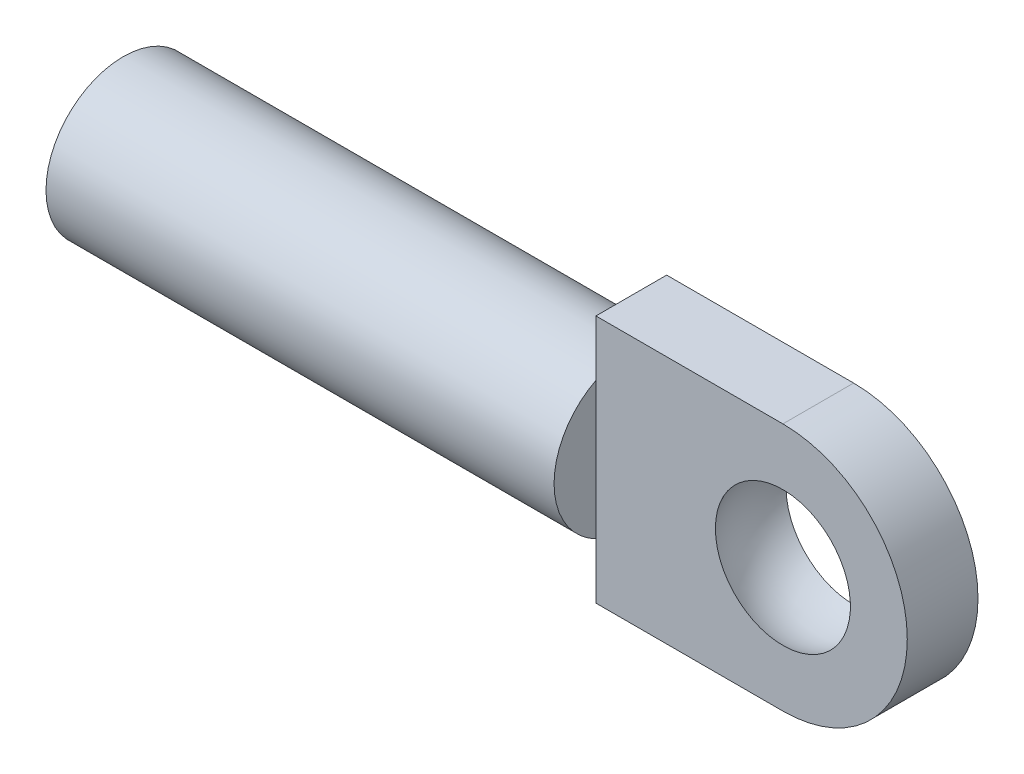
ISO-10303-21;
HEADER;
FILE_DESCRIPTION(('STEP AP214'),'2;1');
FILE_NAME('part.step','',(''),(''),'','','');
FILE_SCHEMA(('AUTOMOTIVE_DESIGN { 1 0 10303 214 1 1 1 1 }'));
ENDSEC;
DATA;
#1=APPLICATION_CONTEXT('core data for automotive mechanical design processes');
#2=APPLICATION_PROTOCOL_DEFINITION('international standard','automotive_design',2000,#1);
#3=PRODUCT_CONTEXT('',#1,'mechanical');
#4=PRODUCT('Part','Part','',(#3));
#5=PRODUCT_RELATED_PRODUCT_CATEGORY('part','',(#4));
#6=PRODUCT_DEFINITION_FORMATION('','',#4);
#7=PRODUCT_DEFINITION_CONTEXT('part definition',#1,'design');
#8=PRODUCT_DEFINITION('design','',#6,#7);
#9=PRODUCT_DEFINITION_SHAPE('','',#8);
#10=(LENGTH_UNIT() NAMED_UNIT(*) SI_UNIT(.MILLI.,.METRE.));
#11=(NAMED_UNIT(*) PLANE_ANGLE_UNIT() SI_UNIT($,.RADIAN.));
#12=(NAMED_UNIT(*) SI_UNIT($,.STERADIAN.) SOLID_ANGLE_UNIT());
#13=UNCERTAINTY_MEASURE_WITH_UNIT(LENGTH_MEASURE(1.E-05),#10,'distance_accuracy_value','');
#14=(GEOMETRIC_REPRESENTATION_CONTEXT(3) GLOBAL_UNCERTAINTY_ASSIGNED_CONTEXT((#13)) GLOBAL_UNIT_ASSIGNED_CONTEXT((#10,
#11,#12)) REPRESENTATION_CONTEXT('',''));
#15=CARTESIAN_POINT('',(0.,0.,0.));
#16=DIRECTION('',(0.,0.,1.));
#17=DIRECTION('',(1.,0.,0.));
#18=AXIS2_PLACEMENT_3D('',#15,#16,#17);
#19=CARTESIAN_POINT('',(0.,0.,-1.1049));
#20=DIRECTION('',(0.,0.,-1.));
#21=DIRECTION('',(-1.,0.,0.));
#22=AXIS2_PLACEMENT_3D('',#19,#20,#21);
#23=PLANE('',#22);
#24=CARTESIAN_POINT('',(0.,0.,-1.1049));
#25=DIRECTION('',(0.,0.,1.));
#26=DIRECTION('',(-1.,0.,0.));
#27=AXIS2_PLACEMENT_3D('',#24,#25,#26);
#28=CIRCLE('',#27,3.8862);
#29=CARTESIAN_POINT('',(0.,-3.8862,-1.1049));
#30=VERTEX_POINT('',#29);
#31=CARTESIAN_POINT('',(0.,3.8862,-1.1049));
#32=VERTEX_POINT('',#31);
#33=EDGE_CURVE('E125',#30,#32,#28,.T.);
#34=ORIENTED_EDGE('',*,*,#33,.F.);
#35=DIRECTION('',(1.,0.,0.));
#36=VECTOR('',#35,1.);
#37=CARTESIAN_POINT('',(0.,-3.8862,-1.1049));
#38=LINE('',#37,#36);
#39=CARTESIAN_POINT('',(-5.842,-3.8862,-1.1049));
#40=VERTEX_POINT('',#39);
#41=EDGE_CURVE('E134',#40,#30,#38,.T.);
#42=ORIENTED_EDGE('',*,*,#41,.F.);
#43=DIRECTION('',(0.,-1.,0.));
#44=VECTOR('',#43,1.);
#45=CARTESIAN_POINT('',(-5.842,3.8862,-1.1049));
#46=LINE('',#45,#44);
#47=CARTESIAN_POINT('',(-5.842,-2.14517248490652,-1.1049));
#48=VERTEX_POINT('',#47);
#49=EDGE_CURVE('E131',#48,#40,#46,.T.);
#50=ORIENTED_EDGE('',*,*,#49,.F.);
#51=CARTESIAN_POINT('',(-5.842,2.14517248490652,-1.1049));
#52=VERTEX_POINT('',#51);
#53=EDGE_CURVE('E55',#52,#48,#46,.T.);
#54=ORIENTED_EDGE('',*,*,#53,.F.);
#55=CARTESIAN_POINT('',(-5.842,3.8862,-1.1049));
#56=VERTEX_POINT('',#55);
#57=EDGE_CURVE('E132',#56,#52,#46,.T.);
#58=ORIENTED_EDGE('',*,*,#57,.F.);
#59=DIRECTION('',(-1.,0.,0.));
#60=VECTOR('',#59,1.);
#61=CARTESIAN_POINT('',(0.,3.8862,-1.1049));
#62=LINE('',#61,#60);
#63=EDGE_CURVE('E128',#32,#56,#62,.T.);
#64=ORIENTED_EDGE('',*,*,#63,.F.);
#65=EDGE_LOOP('',(#34,#42,#50,#54,#58,#64));
#66=FACE_BOUND('',#65,.T.);
#67=CARTESIAN_POINT('',(0.,0.,-1.1049));
#68=DIRECTION('',(0.,0.,-1.));
#69=DIRECTION('',(-1.,0.,0.));
#70=AXIS2_PLACEMENT_3D('',#67,#68,#69);
#71=CIRCLE('',#70,2.10939506790454);
#72=CARTESIAN_POINT('',(-2.10939506790454,0.,-1.1049));
#73=VERTEX_POINT('',#72);
#74=EDGE_CURVE('E275',#73,#73,#71,.F.);
#75=ORIENTED_EDGE('',*,*,#74,.T.);
#76=EDGE_LOOP('',(#75));
#77=FACE_BOUND('',#76,.T.);
#78=ADVANCED_FACE('F31',(#66,#77),#23,.T.);
#79=CARTESIAN_POINT('',(0.,0.,1.1049));
#80=DIRECTION('',(0.,0.,-1.));
#81=DIRECTION('',(-1.,0.,0.));
#82=AXIS2_PLACEMENT_3D('',#79,#80,#81);
#83=PLANE('',#82);
#84=CARTESIAN_POINT('',(0.,0.,1.1049));
#85=DIRECTION('',(0.,0.,1.));
#86=DIRECTION('',(-1.,0.,0.));
#87=AXIS2_PLACEMENT_3D('',#84,#85,#86);
#88=CIRCLE('',#87,3.8862);
#89=CARTESIAN_POINT('',(0.,-3.8862,1.1049));
#90=VERTEX_POINT('',#89);
#91=CARTESIAN_POINT('',(0.,3.8862,1.1049));
#92=VERTEX_POINT('',#91);
#93=EDGE_CURVE('E120',#90,#92,#88,.T.);
#94=ORIENTED_EDGE('',*,*,#93,.T.);
#95=DIRECTION('',(-1.,0.,0.));
#96=VECTOR('',#95,1.);
#97=CARTESIAN_POINT('',(0.,3.8862,1.1049));
#98=LINE('',#97,#96);
#99=CARTESIAN_POINT('',(-5.842,3.8862,1.1049));
#100=VERTEX_POINT('',#99);
#101=EDGE_CURVE('E106',#92,#100,#98,.T.);
#102=ORIENTED_EDGE('',*,*,#101,.T.);
#103=DIRECTION('',(0.,-1.,0.));
#104=VECTOR('',#103,1.);
#105=CARTESIAN_POINT('',(-5.842,3.8862,1.1049));
#106=LINE('',#105,#104);
#107=CARTESIAN_POINT('',(-5.842,2.14517248490652,1.1049));
#108=VERTEX_POINT('',#107);
#109=EDGE_CURVE('E97',#100,#108,#106,.T.);
#110=ORIENTED_EDGE('',*,*,#109,.T.);
#111=CARTESIAN_POINT('',(-5.842,-2.14517248490652,1.1049));
#112=VERTEX_POINT('',#111);
#113=EDGE_CURVE('E88',#108,#112,#106,.T.);
#114=ORIENTED_EDGE('',*,*,#113,.T.);
#115=CARTESIAN_POINT('',(-5.842,-3.8862,1.1049));
#116=VERTEX_POINT('',#115);
#117=EDGE_CURVE('E93',#112,#116,#106,.T.);
#118=ORIENTED_EDGE('',*,*,#117,.T.);
#119=DIRECTION('',(1.,0.,0.));
#120=VECTOR('',#119,1.);
#121=CARTESIAN_POINT('',(0.,-3.8862,1.1049));
#122=LINE('',#121,#120);
#123=EDGE_CURVE('E123',#116,#90,#122,.T.);
#124=ORIENTED_EDGE('',*,*,#123,.T.);
#125=EDGE_LOOP('',(#94,#102,#110,#114,#118,#124));
#126=FACE_BOUND('',#125,.T.);
#127=CARTESIAN_POINT('',(0.,0.,1.1049));
#128=DIRECTION('',(0.,0.,-1.));
#129=DIRECTION('',(-1.,0.,0.));
#130=AXIS2_PLACEMENT_3D('',#127,#128,#129);
#131=CIRCLE('',#130,2.10939506790454);
#132=CARTESIAN_POINT('',(-2.10939506790454,0.,1.1049));
#133=VERTEX_POINT('',#132);
#134=EDGE_CURVE('E35',#133,#133,#131,.F.);
#135=ORIENTED_EDGE('',*,*,#134,.F.);
#136=EDGE_LOOP('',(#135));
#137=FACE_BOUND('',#136,.T.);
#138=ADVANCED_FACE('F90',(#126,#137),#83,.F.);
#139=CARTESIAN_POINT('',(-5.842,3.8862,-1.1049));
#140=DIRECTION('',(-1.,0.,0.));
#141=DIRECTION('',(0.,-1.,0.));
#142=AXIS2_PLACEMENT_3D('',#139,#140,#141);
#143=PLANE('',#142);
#144=CARTESIAN_POINT('',(-5.842,0.,0.));
#145=DIRECTION('',(-1.,0.,0.));
#146=DIRECTION('',(0.,0.,1.));
#147=AXIS2_PLACEMENT_3D('',#144,#145,#146);
#148=CIRCLE('',#147,2.413);
#149=EDGE_CURVE('E42',#108,#52,#148,.T.);
#150=ORIENTED_EDGE('',*,*,#149,.F.);
#151=ORIENTED_EDGE('',*,*,#109,.F.);
#152=DIRECTION('',(0.,0.,1.));
#153=VECTOR('',#152,1.);
#154=CARTESIAN_POINT('',(-5.842,3.8862,-1.1049));
#155=LINE('',#154,#153);
#156=EDGE_CURVE('E140',#56,#100,#155,.T.);
#157=ORIENTED_EDGE('',*,*,#156,.F.);
#158=ORIENTED_EDGE('',*,*,#57,.T.);
#159=EDGE_LOOP('',(#150,#151,#157,#158));
#160=FACE_BOUND('',#159,.T.);
#161=ADVANCED_FACE('F153',(#160),#143,.T.);
#162=CARTESIAN_POINT('',(0.,0.,-1.1049));
#163=DIRECTION('',(0.,0.,1.));
#164=DIRECTION('',(1.,0.,0.));
#165=AXIS2_PLACEMENT_3D('',#162,#163,#164);
#166=CYLINDRICAL_SURFACE('',#165,3.8862);
#167=DIRECTION('',(0.,0.,1.));
#168=VECTOR('',#167,1.);
#169=CARTESIAN_POINT('',(0.,3.8862,-1.1049));
#170=LINE('',#169,#168);
#171=EDGE_CURVE('E137',#32,#92,#170,.T.);
#172=ORIENTED_EDGE('',*,*,#171,.T.);
#173=ORIENTED_EDGE('',*,*,#93,.F.);
#174=DIRECTION('',(0.,0.,1.));
#175=VECTOR('',#174,1.);
#176=CARTESIAN_POINT('',(0.,-3.8862,-1.1049));
#177=LINE('',#176,#175);
#178=EDGE_CURVE('E40',#30,#90,#177,.T.);
#179=ORIENTED_EDGE('',*,*,#178,.F.);
#180=ORIENTED_EDGE('',*,*,#33,.T.);
#181=EDGE_LOOP('',(#172,#173,#179,#180));
#182=FACE_BOUND('',#181,.T.);
#183=ADVANCED_FACE('F33',(#182),#166,.T.);
#184=CARTESIAN_POINT('',(0.,-3.8862,-1.1049));
#185=DIRECTION('',(0.,-1.,0.));
#186=DIRECTION('',(1.,0.,0.));
#187=AXIS2_PLACEMENT_3D('',#184,#185,#186);
#188=PLANE('',#187);
#189=ORIENTED_EDGE('',*,*,#178,.T.);
#190=ORIENTED_EDGE('',*,*,#123,.F.);
#191=DIRECTION('',(0.,0.,1.));
#192=VECTOR('',#191,1.);
#193=CARTESIAN_POINT('',(-5.842,-3.8862,-1.1049));
#194=LINE('',#193,#192);
#195=EDGE_CURVE('E104',#40,#116,#194,.T.);
#196=ORIENTED_EDGE('',*,*,#195,.F.);
#197=ORIENTED_EDGE('',*,*,#41,.T.);
#198=EDGE_LOOP('',(#189,#190,#196,#197));
#199=FACE_BOUND('',#198,.T.);
#200=ADVANCED_FACE('F149',(#199),#188,.T.);
#201=EDGE_CURVE('E11',#48,#112,#148,.T.);
#202=ORIENTED_EDGE('',*,*,#201,.F.);
#203=ORIENTED_EDGE('',*,*,#49,.T.);
#204=ORIENTED_EDGE('',*,*,#195,.T.);
#205=ORIENTED_EDGE('',*,*,#117,.F.);
#206=EDGE_LOOP('',(#202,#203,#204,#205));
#207=FACE_BOUND('',#206,.T.);
#208=ADVANCED_FACE('F102',(#207),#143,.T.);
#209=CARTESIAN_POINT('',(0.,3.8862,-1.1049));
#210=DIRECTION('',(0.,1.,0.));
#211=DIRECTION('',(-1.,0.,0.));
#212=AXIS2_PLACEMENT_3D('',#209,#210,#211);
#213=PLANE('',#212);
#214=ORIENTED_EDGE('',*,*,#156,.T.);
#215=ORIENTED_EDGE('',*,*,#101,.F.);
#216=ORIENTED_EDGE('',*,*,#171,.F.);
#217=ORIENTED_EDGE('',*,*,#63,.T.);
#218=EDGE_LOOP('',(#214,#215,#216,#217));
#219=FACE_BOUND('',#218,.T.);
#220=ADVANCED_FACE('F147',(#219),#213,.T.);
#221=CARTESIAN_POINT('',(-5.842,0.,0.));
#222=DIRECTION('',(-1.,0.,0.));
#223=DIRECTION('',(0.,0.,1.));
#224=AXIS2_PLACEMENT_3D('',#221,#222,#223);
#225=PLANE('',#224);
#226=EDGE_CURVE('E43',#52,#48,#148,.T.);
#227=ORIENTED_EDGE('',*,*,#226,.F.);
#228=ORIENTED_EDGE('',*,*,#53,.T.);
#229=EDGE_LOOP('',(#227,#228));
#230=FACE_BOUND('',#229,.T.);
#231=ADVANCED_FACE('F184',(#230),#225,.F.);
#232=CARTESIAN_POINT('',(-21.717,0.,0.));
#233=DIRECTION('',(1.,0.,0.));
#234=DIRECTION('',(0.,0.,-1.));
#235=AXIS2_PLACEMENT_3D('',#232,#233,#234);
#236=CYLINDRICAL_SURFACE('',#235,2.413);
#237=CARTESIAN_POINT('',(-21.717,0.,0.));
#238=DIRECTION('',(-1.,0.,0.));
#239=DIRECTION('',(0.,0.,1.));
#240=AXIS2_PLACEMENT_3D('',#237,#238,#239);
#241=CIRCLE('',#240,2.413);
#242=CARTESIAN_POINT('',(-21.717,0.,2.413));
#243=VERTEX_POINT('',#242);
#244=EDGE_CURVE('E116',#243,#243,#241,.T.);
#245=ORIENTED_EDGE('',*,*,#244,.F.);
#246=EDGE_LOOP('',(#245));
#247=FACE_BOUND('',#246,.T.);
#248=ORIENTED_EDGE('',*,*,#149,.T.);
#249=ORIENTED_EDGE('',*,*,#226,.T.);
#250=ORIENTED_EDGE('',*,*,#201,.T.);
#251=EDGE_CURVE('E107',#112,#108,#148,.T.);
#252=ORIENTED_EDGE('',*,*,#251,.T.);
#253=EDGE_LOOP('',(#248,#249,#250,#252));
#254=FACE_BOUND('',#253,.T.);
#255=ADVANCED_FACE('F113',(#247,#254),#236,.T.);
#256=CARTESIAN_POINT('',(-21.717,0.,0.));
#257=DIRECTION('',(-1.,0.,0.));
#258=DIRECTION('',(0.,0.,1.));
#259=AXIS2_PLACEMENT_3D('',#256,#257,#258);
#260=PLANE('',#259);
#261=CARTESIAN_POINT('',(-21.717,0.,0.));
#262=DIRECTION('',(-1.,0.,0.));
#263=DIRECTION('',(0.,0.,1.));
#264=AXIS2_PLACEMENT_3D('',#261,#262,#263);
#265=CIRCLE('',#264,1.2065);
#266=CARTESIAN_POINT('',(-21.717,0.,1.2065));
#267=VERTEX_POINT('',#266);
#268=EDGE_CURVE('E278',#267,#267,#265,.T.);
#269=ORIENTED_EDGE('',*,*,#268,.F.);
#270=EDGE_LOOP('',(#269));
#271=FACE_BOUND('',#270,.T.);
#272=ORIENTED_EDGE('',*,*,#244,.T.);
#273=EDGE_LOOP('',(#272));
#274=FACE_BOUND('',#273,.T.);
#275=ADVANCED_FACE('F195',(#271,#274),#260,.T.);
#276=ORIENTED_EDGE('',*,*,#113,.F.);
#277=ORIENTED_EDGE('',*,*,#251,.F.);
#278=EDGE_LOOP('',(#276,#277));
#279=FACE_BOUND('',#278,.T.);
#280=ADVANCED_FACE('F108',(#279),#225,.F.);
#281=CARTESIAN_POINT('',(-6.858,0.,0.));
#282=DIRECTION('',(-1.,0.,0.));
#283=DIRECTION('',(0.,0.,1.));
#284=AXIS2_PLACEMENT_3D('',#281,#282,#283);
#285=CYLINDRICAL_SURFACE('',#284,1.2065);
#286=CARTESIAN_POINT('',(-6.858,0.,0.));
#287=DIRECTION('',(-1.,0.,0.));
#288=DIRECTION('',(0.,0.,1.));
#289=AXIS2_PLACEMENT_3D('',#286,#287,#288);
#290=CIRCLE('',#289,1.2065);
#291=CARTESIAN_POINT('',(-6.858,0.,1.2065));
#292=VERTEX_POINT('',#291);
#293=EDGE_CURVE('E111',#292,#292,#290,.T.);
#294=ORIENTED_EDGE('',*,*,#293,.F.);
#295=EDGE_LOOP('',(#294));
#296=FACE_BOUND('',#295,.T.);
#297=ORIENTED_EDGE('',*,*,#268,.T.);
#298=EDGE_LOOP('',(#297));
#299=FACE_BOUND('',#298,.T.);
#300=ADVANCED_FACE('F210',(#296,#299),#285,.F.);
#301=CARTESIAN_POINT('',(-6.858,0.,0.));
#302=DIRECTION('',(-1.,0.,0.));
#303=DIRECTION('',(0.,0.,1.));
#304=AXIS2_PLACEMENT_3D('',#301,#302,#303);
#305=PLANE('',#304);
#306=ORIENTED_EDGE('',*,*,#293,.T.);
#307=EDGE_LOOP('',(#306));
#308=FACE_BOUND('',#307,.T.);
#309=ADVANCED_FACE('F215',(#308),#305,.T.);
#310=CARTESIAN_POINT('',(0.,0.,0.));
#311=DIRECTION('',(0.,-1.,0.));
#312=DIRECTION('',(-1.,0.,0.));
#313=AXIS2_PLACEMENT_3D('',#310,#311,#312);
#314=SPHERICAL_SURFACE('',#313,2.38125);
#315=CARTESIAN_POINT('',(0.,0.,0.));
#316=DIRECTION('',(0.,0.,-1.));
#317=DIRECTION('',(-1.,0.,0.));
#318=AXIS2_PLACEMENT_3D('',#315,#316,#317);
#319=SPHERICAL_SURFACE('',#318,2.38125);
#320=ORIENTED_EDGE('',*,*,#74,.F.);
#321=EDGE_LOOP('',(#320));
#322=FACE_BOUND('',#321,.T.);
#323=ORIENTED_EDGE('',*,*,#134,.T.);
#324=EDGE_LOOP('',(#323));
#325=FACE_BOUND('',#324,.T.);
#326=ADVANCED_FACE('F223',(#322,#325),#319,.F.);
#327=CLOSED_SHELL('',(#78,#138,#161,#183,#200,#208,#220,#231,#255,#275,#280,#300,#309,#326));
#328=MANIFOLD_SOLID_BREP('B2',#327);
#329=ADVANCED_BREP_SHAPE_REPRESENTATION('',(#18,#328),#14);
#330=SHAPE_DEFINITION_REPRESENTATION(#9,#329);
ENDSEC;
END-ISO-10303-21;
